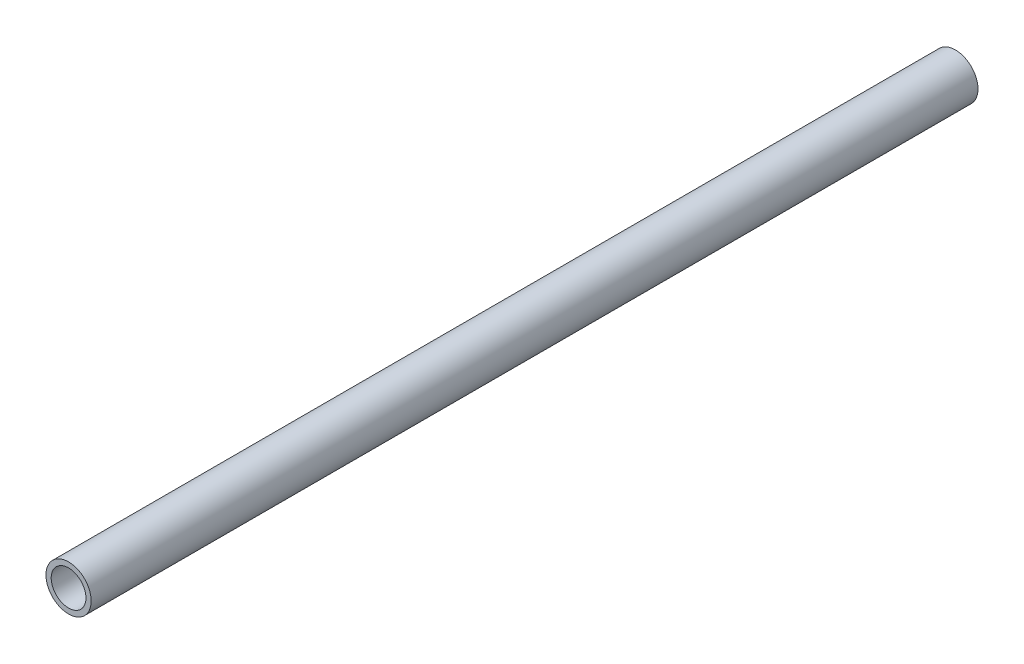
ISO-10303-21;
HEADER;
FILE_DESCRIPTION(('STEP AP214'),'2;1');
FILE_NAME('part.step','',(''),(''),'','','');
FILE_SCHEMA(('AUTOMOTIVE_DESIGN { 1 0 10303 214 1 1 1 1 }'));
ENDSEC;
DATA;
#1=APPLICATION_CONTEXT('core data for automotive mechanical design processes');
#2=APPLICATION_PROTOCOL_DEFINITION('international standard','automotive_design',2000,#1);
#3=PRODUCT_CONTEXT('',#1,'mechanical');
#4=PRODUCT('Part','Part','',(#3));
#5=PRODUCT_RELATED_PRODUCT_CATEGORY('part','',(#4));
#6=PRODUCT_DEFINITION_FORMATION('','',#4);
#7=PRODUCT_DEFINITION_CONTEXT('part definition',#1,'design');
#8=PRODUCT_DEFINITION('design','',#6,#7);
#9=PRODUCT_DEFINITION_SHAPE('','',#8);
#10=(LENGTH_UNIT() NAMED_UNIT(*) SI_UNIT(.MILLI.,.METRE.));
#11=(NAMED_UNIT(*) PLANE_ANGLE_UNIT() SI_UNIT($,.RADIAN.));
#12=(NAMED_UNIT(*) SI_UNIT($,.STERADIAN.) SOLID_ANGLE_UNIT());
#13=UNCERTAINTY_MEASURE_WITH_UNIT(LENGTH_MEASURE(1.E-05),#10,'distance_accuracy_value','');
#14=(GEOMETRIC_REPRESENTATION_CONTEXT(3) GLOBAL_UNCERTAINTY_ASSIGNED_CONTEXT((#13)) GLOBAL_UNIT_ASSIGNED_CONTEXT((#10,
#11,#12)) REPRESENTATION_CONTEXT('',''));
#15=CARTESIAN_POINT('',(0.,0.,0.));
#16=DIRECTION('',(0.,0.,1.));
#17=DIRECTION('',(1.,0.,0.));
#18=AXIS2_PLACEMENT_3D('',#15,#16,#17);
#19=CARTESIAN_POINT('',(0.,0.,647.7));
#20=DIRECTION('',(0.,0.,1.));
#21=DIRECTION('',(1.,0.,0.));
#22=AXIS2_PLACEMENT_3D('',#19,#20,#21);
#23=PLANE('',#22);
#24=CARTESIAN_POINT('',(0.,0.,647.7));
#25=DIRECTION('',(0.,0.,1.));
#26=DIRECTION('',(1.,0.,0.));
#27=AXIS2_PLACEMENT_3D('',#24,#25,#26);
#28=CIRCLE('',#27,16.51);
#29=CARTESIAN_POINT('',(16.51,0.,647.7));
#30=VERTEX_POINT('',#29);
#31=EDGE_CURVE('E10',#30,#30,#28,.T.);
#32=ORIENTED_EDGE('',*,*,#31,.T.);
#33=EDGE_LOOP('',(#32));
#34=FACE_BOUND('',#33,.T.);
#35=CARTESIAN_POINT('',(0.,0.,647.7));
#36=DIRECTION('',(0.,0.,1.));
#37=DIRECTION('',(1.,0.,0.));
#38=AXIS2_PLACEMENT_3D('',#35,#36,#37);
#39=CIRCLE('',#38,12.7);
#40=CARTESIAN_POINT('',(12.7,0.,647.7));
#41=VERTEX_POINT('',#40);
#42=EDGE_CURVE('E43',#41,#41,#39,.T.);
#43=ORIENTED_EDGE('',*,*,#42,.F.);
#44=EDGE_LOOP('',(#43));
#45=FACE_BOUND('',#44,.T.);
#46=ADVANCED_FACE('F32',(#34,#45),#23,.T.);
#47=CARTESIAN_POINT('',(0.,0.,0.));
#48=DIRECTION('',(0.,0.,1.));
#49=DIRECTION('',(1.,0.,0.));
#50=AXIS2_PLACEMENT_3D('',#47,#48,#49);
#51=PLANE('',#50);
#52=CARTESIAN_POINT('',(0.,0.,0.));
#53=DIRECTION('',(0.,0.,1.));
#54=DIRECTION('',(1.,0.,0.));
#55=AXIS2_PLACEMENT_3D('',#52,#53,#54);
#56=CIRCLE('',#55,16.51);
#57=CARTESIAN_POINT('',(16.51,0.,0.));
#58=VERTEX_POINT('',#57);
#59=EDGE_CURVE('E36',#58,#58,#56,.T.);
#60=ORIENTED_EDGE('',*,*,#59,.F.);
#61=EDGE_LOOP('',(#60));
#62=FACE_BOUND('',#61,.T.);
#63=CARTESIAN_POINT('',(0.,0.,0.));
#64=DIRECTION('',(0.,0.,1.));
#65=DIRECTION('',(1.,0.,0.));
#66=AXIS2_PLACEMENT_3D('',#63,#64,#65);
#67=CIRCLE('',#66,12.7);
#68=CARTESIAN_POINT('',(12.7,0.,0.));
#69=VERTEX_POINT('',#68);
#70=EDGE_CURVE('E45',#69,#69,#67,.T.);
#71=ORIENTED_EDGE('',*,*,#70,.T.);
#72=EDGE_LOOP('',(#71));
#73=FACE_BOUND('',#72,.T.);
#74=ADVANCED_FACE('F55',(#62,#73),#51,.F.);
#75=CARTESIAN_POINT('',(0.,0.,647.7));
#76=DIRECTION('',(0.,0.,-1.));
#77=DIRECTION('',(-1.,0.,0.));
#78=AXIS2_PLACEMENT_3D('',#75,#76,#77);
#79=CYLINDRICAL_SURFACE('',#78,16.51);
#80=ORIENTED_EDGE('',*,*,#31,.F.);
#81=EDGE_LOOP('',(#80));
#82=FACE_BOUND('',#81,.T.);
#83=ORIENTED_EDGE('',*,*,#59,.T.);
#84=EDGE_LOOP('',(#83));
#85=FACE_BOUND('',#84,.T.);
#86=ADVANCED_FACE('F34',(#82,#85),#79,.T.);
#87=CARTESIAN_POINT('',(0.,0.,647.7));
#88=DIRECTION('',(0.,0.,-1.));
#89=DIRECTION('',(-1.,0.,0.));
#90=AXIS2_PLACEMENT_3D('',#87,#88,#89);
#91=CYLINDRICAL_SURFACE('',#90,12.7);
#92=ORIENTED_EDGE('',*,*,#42,.T.);
#93=EDGE_LOOP('',(#92));
#94=FACE_BOUND('',#93,.T.);
#95=ORIENTED_EDGE('',*,*,#70,.F.);
#96=EDGE_LOOP('',(#95));
#97=FACE_BOUND('',#96,.T.);
#98=ADVANCED_FACE('F51',(#94,#97),#91,.F.);
#99=CLOSED_SHELL('',(#46,#74,#86,#98));
#100=MANIFOLD_SOLID_BREP('B2',#99);
#101=ADVANCED_BREP_SHAPE_REPRESENTATION('',(#18,#100),#14);
#102=SHAPE_DEFINITION_REPRESENTATION(#9,#101);
ENDSEC;
END-ISO-10303-21;
